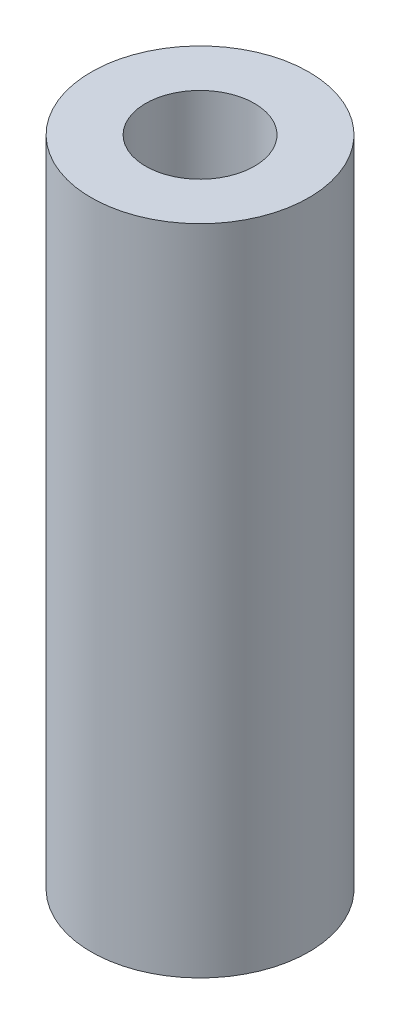
ISO-10303-21;
HEADER;
FILE_DESCRIPTION(('STEP AP214'),'2;1');
FILE_NAME('part.step','',(''),(''),'','','');
FILE_SCHEMA(('AUTOMOTIVE_DESIGN { 1 0 10303 214 1 1 1 1 }'));
ENDSEC;
DATA;
#1=APPLICATION_CONTEXT('core data for automotive mechanical design processes');
#2=APPLICATION_PROTOCOL_DEFINITION('international standard','automotive_design',2000,#1);
#3=PRODUCT_CONTEXT('',#1,'mechanical');
#4=PRODUCT('Part','Part','',(#3));
#5=PRODUCT_RELATED_PRODUCT_CATEGORY('part','',(#4));
#6=PRODUCT_DEFINITION_FORMATION('','',#4);
#7=PRODUCT_DEFINITION_CONTEXT('part definition',#1,'design');
#8=PRODUCT_DEFINITION('design','',#6,#7);
#9=PRODUCT_DEFINITION_SHAPE('','',#8);
#10=(LENGTH_UNIT() NAMED_UNIT(*) SI_UNIT(.MILLI.,.METRE.));
#11=(NAMED_UNIT(*) PLANE_ANGLE_UNIT() SI_UNIT($,.RADIAN.));
#12=(NAMED_UNIT(*) SI_UNIT($,.STERADIAN.) SOLID_ANGLE_UNIT());
#13=UNCERTAINTY_MEASURE_WITH_UNIT(LENGTH_MEASURE(1.E-05),#10,'distance_accuracy_value','');
#14=(GEOMETRIC_REPRESENTATION_CONTEXT(3) GLOBAL_UNCERTAINTY_ASSIGNED_CONTEXT((#13)) GLOBAL_UNIT_ASSIGNED_CONTEXT((#10,
#11,#12)) REPRESENTATION_CONTEXT('',''));
#15=CARTESIAN_POINT('',(0.,0.,0.));
#16=DIRECTION('',(0.,0.,1.));
#17=DIRECTION('',(1.,0.,0.));
#18=AXIS2_PLACEMENT_3D('',#15,#16,#17);
#19=CARTESIAN_POINT('',(0.,38.1,0.));
#20=DIRECTION('',(0.,1.,0.));
#21=DIRECTION('',(0.,0.,1.));
#22=AXIS2_PLACEMENT_3D('',#19,#20,#21);
#23=PLANE('',#22);
#24=CARTESIAN_POINT('',(0.,38.1,0.));
#25=DIRECTION('',(0.,1.,0.));
#26=DIRECTION('',(0.,0.,1.));
#27=AXIS2_PLACEMENT_3D('',#24,#25,#26);
#28=CIRCLE('',#27,6.35);
#29=CARTESIAN_POINT('',(0.,38.1,-6.35));
#30=VERTEX_POINT('',#29);
#31=EDGE_CURVE('E10',#30,#30,#28,.T.);
#32=ORIENTED_EDGE('',*,*,#31,.T.);
#33=EDGE_LOOP('',(#32));
#34=FACE_BOUND('',#33,.T.);
#35=CARTESIAN_POINT('',(0.,38.1,0.));
#36=DIRECTION('',(0.,1.,0.));
#37=DIRECTION('',(0.,0.,1.));
#38=AXIS2_PLACEMENT_3D('',#35,#36,#37);
#39=CIRCLE('',#38,3.175);
#40=CARTESIAN_POINT('',(0.,38.1,-3.175));
#41=VERTEX_POINT('',#40);
#42=EDGE_CURVE('E41',#41,#41,#39,.T.);
#43=ORIENTED_EDGE('',*,*,#42,.F.);
#44=EDGE_LOOP('',(#43));
#45=FACE_BOUND('',#44,.T.);
#46=ADVANCED_FACE('F30',(#34,#45),#23,.T.);
#47=CARTESIAN_POINT('',(0.,0.,0.));
#48=DIRECTION('',(0.,1.,0.));
#49=DIRECTION('',(0.,0.,1.));
#50=AXIS2_PLACEMENT_3D('',#47,#48,#49);
#51=PLANE('',#50);
#52=CARTESIAN_POINT('',(0.,0.,0.));
#53=DIRECTION('',(0.,1.,0.));
#54=DIRECTION('',(0.,0.,1.));
#55=AXIS2_PLACEMENT_3D('',#52,#53,#54);
#56=CIRCLE('',#55,6.35);
#57=CARTESIAN_POINT('',(0.,0.,-6.35));
#58=VERTEX_POINT('',#57);
#59=EDGE_CURVE('E34',#58,#58,#56,.T.);
#60=ORIENTED_EDGE('',*,*,#59,.F.);
#61=EDGE_LOOP('',(#60));
#62=FACE_BOUND('',#61,.T.);
#63=CARTESIAN_POINT('',(0.,0.,0.));
#64=DIRECTION('',(0.,1.,0.));
#65=DIRECTION('',(0.,0.,1.));
#66=AXIS2_PLACEMENT_3D('',#63,#64,#65);
#67=CIRCLE('',#66,3.175);
#68=CARTESIAN_POINT('',(0.,0.,-3.175));
#69=VERTEX_POINT('',#68);
#70=EDGE_CURVE('E43',#69,#69,#67,.T.);
#71=ORIENTED_EDGE('',*,*,#70,.T.);
#72=EDGE_LOOP('',(#71));
#73=FACE_BOUND('',#72,.T.);
#74=ADVANCED_FACE('F53',(#62,#73),#51,.F.);
#75=CARTESIAN_POINT('',(0.,38.1,0.));
#76=DIRECTION('',(0.,-1.,0.));
#77=DIRECTION('',(0.,0.,-1.));
#78=AXIS2_PLACEMENT_3D('',#75,#76,#77);
#79=CYLINDRICAL_SURFACE('',#78,6.35);
#80=CARTESIAN_POINT('',(0.,38.1,-6.35));
#81=CARTESIAN_POINT('',(0.,37.703125,-6.35));
#82=CARTESIAN_POINT('',(0.,37.30625,-6.35));
#83=CARTESIAN_POINT('',(0.,36.5125,-6.35));
#84=CARTESIAN_POINT('',(0.,36.115625,-6.35));
#85=CARTESIAN_POINT('',(0.,35.321875,-6.35));
#86=CARTESIAN_POINT('',(0.,34.925,-6.35));
#87=CARTESIAN_POINT('',(0.,34.13125,-6.35));
#88=CARTESIAN_POINT('',(0.,33.734375,-6.35));
#89=CARTESIAN_POINT('',(0.,32.940625,-6.35));
#90=CARTESIAN_POINT('',(0.,32.54375,-6.35));
#91=CARTESIAN_POINT('',(0.,31.75,-6.35));
#92=CARTESIAN_POINT('',(0.,31.353125,-6.35));
#93=CARTESIAN_POINT('',(0.,30.559375,-6.35));
#94=CARTESIAN_POINT('',(0.,30.1625,-6.35));
#95=CARTESIAN_POINT('',(0.,29.36875,-6.35));
#96=CARTESIAN_POINT('',(0.,28.971875,-6.35));
#97=CARTESIAN_POINT('',(0.,28.178125,-6.35));
#98=CARTESIAN_POINT('',(0.,27.78125,-6.35));
#99=CARTESIAN_POINT('',(0.,26.9875,-6.35));
#100=CARTESIAN_POINT('',(0.,26.590625,-6.35));
#101=CARTESIAN_POINT('',(0.,25.796875,-6.35));
#102=CARTESIAN_POINT('',(0.,25.4,-6.35));
#103=CARTESIAN_POINT('',(0.,24.60625,-6.35));
#104=CARTESIAN_POINT('',(0.,24.209375,-6.35));
#105=CARTESIAN_POINT('',(0.,23.415625,-6.35));
#106=CARTESIAN_POINT('',(0.,23.01875,-6.35));
#107=CARTESIAN_POINT('',(0.,22.225,-6.35));
#108=CARTESIAN_POINT('',(0.,21.828125,-6.35));
#109=CARTESIAN_POINT('',(0.,21.034375,-6.35));
#110=CARTESIAN_POINT('',(0.,20.6375,-6.35));
#111=CARTESIAN_POINT('',(0.,19.84375,-6.35));
#112=CARTESIAN_POINT('',(0.,19.446875,-6.35));
#113=CARTESIAN_POINT('',(0.,18.653125,-6.35));
#114=CARTESIAN_POINT('',(0.,18.25625,-6.35));
#115=CARTESIAN_POINT('',(0.,17.4625,-6.35));
#116=CARTESIAN_POINT('',(0.,17.065625,-6.35));
#117=CARTESIAN_POINT('',(0.,16.271875,-6.35));
#118=CARTESIAN_POINT('',(0.,15.875,-6.35));
#119=CARTESIAN_POINT('',(0.,15.08125,-6.35));
#120=CARTESIAN_POINT('',(0.,14.684375,-6.35));
#121=CARTESIAN_POINT('',(0.,13.890625,-6.35));
#122=CARTESIAN_POINT('',(0.,13.49375,-6.35));
#123=CARTESIAN_POINT('',(0.,12.7,-6.35));
#124=CARTESIAN_POINT('',(0.,12.303125,-6.35));
#125=CARTESIAN_POINT('',(0.,11.509375,-6.35));
#126=CARTESIAN_POINT('',(0.,11.1125,-6.35));
#127=CARTESIAN_POINT('',(0.,10.31875,-6.35));
#128=CARTESIAN_POINT('',(0.,9.921875,-6.35));
#129=CARTESIAN_POINT('',(0.,9.128125,-6.35));
#130=CARTESIAN_POINT('',(0.,8.73125,-6.35));
#131=CARTESIAN_POINT('',(0.,7.9375,-6.35));
#132=CARTESIAN_POINT('',(0.,7.540625,-6.35));
#133=CARTESIAN_POINT('',(0.,6.746875,-6.35));
#134=CARTESIAN_POINT('',(0.,6.35,-6.35));
#135=CARTESIAN_POINT('',(0.,5.55625,-6.35));
#136=CARTESIAN_POINT('',(0.,5.159375,-6.35));
#137=CARTESIAN_POINT('',(0.,4.365625,-6.35));
#138=CARTESIAN_POINT('',(0.,3.96875,-6.35));
#139=CARTESIAN_POINT('',(0.,3.175,-6.35));
#140=CARTESIAN_POINT('',(0.,2.778125,-6.35));
#141=CARTESIAN_POINT('',(0.,1.984375,-6.35));
#142=CARTESIAN_POINT('',(0.,1.5875,-6.35));
#143=CARTESIAN_POINT('',(0.,0.79375,-6.35));
#144=CARTESIAN_POINT('',(0.,0.396875,-6.35));
#145=CARTESIAN_POINT('',(0.,0.,-6.35));
#146=B_SPLINE_CURVE_WITH_KNOTS('',3,(#80,#81,#82,#83,#84,#85,#86,#87,#88,#89,#90,#91,#92,#93,
#94,#95,#96,#97,#98,#99,#100,#101,#102,#103,#104,#105,#106,#107,#108,#109,#110,#111,#112,#113,
#114,#115,#116,#117,#118,#119,#120,#121,#122,#123,#124,#125,#126,#127,#128,#129,#130,#131,#132,
#133,#134,#135,#136,#137,#138,#139,#140,#141,#142,#143,#144,#145),.UNSPECIFIED.,.F.,.F.,(4,2,2,
2,2,2,2,2,2,2,2,2,2,2,2,2,2,2,2,2,2,2,2,2,2,2,2,2,2,2,2,2,4),(0.,1.19062499999999,
2.38124999999999,3.571875,4.7625,5.953125,7.14375,8.33437499999999,9.525,10.715625,11.90625,
13.096875,14.2875,15.478125,16.66875,17.859375,19.05,20.240625,21.43125,22.621875,23.8125,
25.003125,26.19375,27.384375,28.575,29.765625,30.95625,32.146875,33.3375,34.528125,35.71875,
36.909375,38.1),.UNSPECIFIED.);
#147=EDGE_CURVE('BSEAM32',#30,#58,#146,.T.);
#148=ORIENTED_EDGE('',*,*,#31,.F.);
#149=ORIENTED_EDGE('',*,*,#59,.T.);
#150=ORIENTED_EDGE('',*,*,#147,.T.);
#151=ORIENTED_EDGE('',*,*,#147,.F.);
#152=EDGE_LOOP('',(#148,#150,#149,#151));
#153=FACE_BOUND('',#152,.T.);
#154=ADVANCED_FACE('F32',(#153),#79,.T.);
#155=CARTESIAN_POINT('',(0.,38.1,0.));
#156=DIRECTION('',(0.,-1.,0.));
#157=DIRECTION('',(0.,0.,-1.));
#158=AXIS2_PLACEMENT_3D('',#155,#156,#157);
#159=CYLINDRICAL_SURFACE('',#158,3.175);
#160=CARTESIAN_POINT('',(0.,38.1,-3.175));
#161=CARTESIAN_POINT('',(0.,37.703125,-3.175));
#162=CARTESIAN_POINT('',(0.,37.30625,-3.175));
#163=CARTESIAN_POINT('',(0.,36.5125,-3.175));
#164=CARTESIAN_POINT('',(0.,36.115625,-3.175));
#165=CARTESIAN_POINT('',(0.,35.321875,-3.175));
#166=CARTESIAN_POINT('',(0.,34.925,-3.175));
#167=CARTESIAN_POINT('',(0.,34.13125,-3.175));
#168=CARTESIAN_POINT('',(0.,33.734375,-3.175));
#169=CARTESIAN_POINT('',(0.,32.940625,-3.175));
#170=CARTESIAN_POINT('',(0.,32.54375,-3.175));
#171=CARTESIAN_POINT('',(0.,31.75,-3.175));
#172=CARTESIAN_POINT('',(0.,31.353125,-3.175));
#173=CARTESIAN_POINT('',(0.,30.559375,-3.175));
#174=CARTESIAN_POINT('',(0.,30.1625,-3.175));
#175=CARTESIAN_POINT('',(0.,29.36875,-3.175));
#176=CARTESIAN_POINT('',(0.,28.971875,-3.175));
#177=CARTESIAN_POINT('',(0.,28.178125,-3.175));
#178=CARTESIAN_POINT('',(0.,27.78125,-3.175));
#179=CARTESIAN_POINT('',(0.,26.9875,-3.175));
#180=CARTESIAN_POINT('',(0.,26.590625,-3.175));
#181=CARTESIAN_POINT('',(0.,25.796875,-3.175));
#182=CARTESIAN_POINT('',(0.,25.4,-3.175));
#183=CARTESIAN_POINT('',(0.,24.60625,-3.175));
#184=CARTESIAN_POINT('',(0.,24.209375,-3.175));
#185=CARTESIAN_POINT('',(0.,23.415625,-3.175));
#186=CARTESIAN_POINT('',(0.,23.01875,-3.175));
#187=CARTESIAN_POINT('',(0.,22.225,-3.175));
#188=CARTESIAN_POINT('',(0.,21.828125,-3.175));
#189=CARTESIAN_POINT('',(0.,21.034375,-3.175));
#190=CARTESIAN_POINT('',(0.,20.6375,-3.175));
#191=CARTESIAN_POINT('',(0.,19.84375,-3.175));
#192=CARTESIAN_POINT('',(0.,19.446875,-3.175));
#193=CARTESIAN_POINT('',(0.,18.653125,-3.175));
#194=CARTESIAN_POINT('',(0.,18.25625,-3.175));
#195=CARTESIAN_POINT('',(0.,17.4625,-3.175));
#196=CARTESIAN_POINT('',(0.,17.065625,-3.175));
#197=CARTESIAN_POINT('',(0.,16.271875,-3.175));
#198=CARTESIAN_POINT('',(0.,15.875,-3.175));
#199=CARTESIAN_POINT('',(0.,15.08125,-3.175));
#200=CARTESIAN_POINT('',(0.,14.684375,-3.175));
#201=CARTESIAN_POINT('',(0.,13.890625,-3.175));
#202=CARTESIAN_POINT('',(0.,13.49375,-3.175));
#203=CARTESIAN_POINT('',(0.,12.7,-3.175));
#204=CARTESIAN_POINT('',(0.,12.303125,-3.175));
#205=CARTESIAN_POINT('',(0.,11.509375,-3.175));
#206=CARTESIAN_POINT('',(0.,11.1125,-3.175));
#207=CARTESIAN_POINT('',(0.,10.31875,-3.175));
#208=CARTESIAN_POINT('',(0.,9.921875,-3.175));
#209=CARTESIAN_POINT('',(0.,9.128125,-3.175));
#210=CARTESIAN_POINT('',(0.,8.73125,-3.175));
#211=CARTESIAN_POINT('',(0.,7.9375,-3.175));
#212=CARTESIAN_POINT('',(0.,7.540625,-3.175));
#213=CARTESIAN_POINT('',(0.,6.746875,-3.175));
#214=CARTESIAN_POINT('',(0.,6.35,-3.175));
#215=CARTESIAN_POINT('',(0.,5.55625,-3.175));
#216=CARTESIAN_POINT('',(0.,5.159375,-3.175));
#217=CARTESIAN_POINT('',(0.,4.365625,-3.175));
#218=CARTESIAN_POINT('',(0.,3.96875,-3.175));
#219=CARTESIAN_POINT('',(0.,3.175,-3.175));
#220=CARTESIAN_POINT('',(0.,2.778125,-3.175));
#221=CARTESIAN_POINT('',(0.,1.984375,-3.175));
#222=CARTESIAN_POINT('',(0.,1.5875,-3.175));
#223=CARTESIAN_POINT('',(0.,0.79375,-3.175));
#224=CARTESIAN_POINT('',(0.,0.396875,-3.175));
#225=CARTESIAN_POINT('',(0.,0.,-3.175));
#226=B_SPLINE_CURVE_WITH_KNOTS('',3,(#160,#161,#162,#163,#164,#165,#166,#167,#168,#169,#170,
#171,#172,#173,#174,#175,#176,#177,#178,#179,#180,#181,#182,#183,#184,#185,#186,#187,#188,#189,
#190,#191,#192,#193,#194,#195,#196,#197,#198,#199,#200,#201,#202,#203,#204,#205,#206,#207,#208,
#209,#210,#211,#212,#213,#214,#215,#216,#217,#218,#219,#220,#221,#222,#223,#224,#225),
.UNSPECIFIED.,.F.,.F.,(4,2,2,2,2,2,2,2,2,2,2,2,2,2,2,2,2,2,2,2,2,2,2,2,2,2,2,2,2,2,2,2,4),(0.,
1.19062499999999,2.38124999999999,3.571875,4.7625,5.953125,7.14375,8.33437499999999,9.525,
10.715625,11.90625,13.096875,14.2875,15.478125,16.66875,17.859375,19.05,20.240625,21.43125,
22.621875,23.8125,25.003125,26.19375,27.384375,28.575,29.765625,30.95625,32.146875,33.3375,
34.528125,35.71875,36.909375,38.1),.UNSPECIFIED.);
#227=EDGE_CURVE('BSEAM49',#41,#69,#226,.T.);
#228=ORIENTED_EDGE('',*,*,#42,.T.);
#229=ORIENTED_EDGE('',*,*,#70,.F.);
#230=ORIENTED_EDGE('',*,*,#227,.T.);
#231=ORIENTED_EDGE('',*,*,#227,.F.);
#232=EDGE_LOOP('',(#228,#230,#229,#231));
#233=FACE_BOUND('',#232,.T.);
#234=ADVANCED_FACE('F49',(#233),#159,.F.);
#235=CLOSED_SHELL('',(#46,#74,#154,#234));
#236=MANIFOLD_SOLID_BREP('B2',#235);
#237=ADVANCED_BREP_SHAPE_REPRESENTATION('',(#18,#236),#14);
#238=SHAPE_DEFINITION_REPRESENTATION(#9,#237);
ENDSEC;
END-ISO-10303-21;
